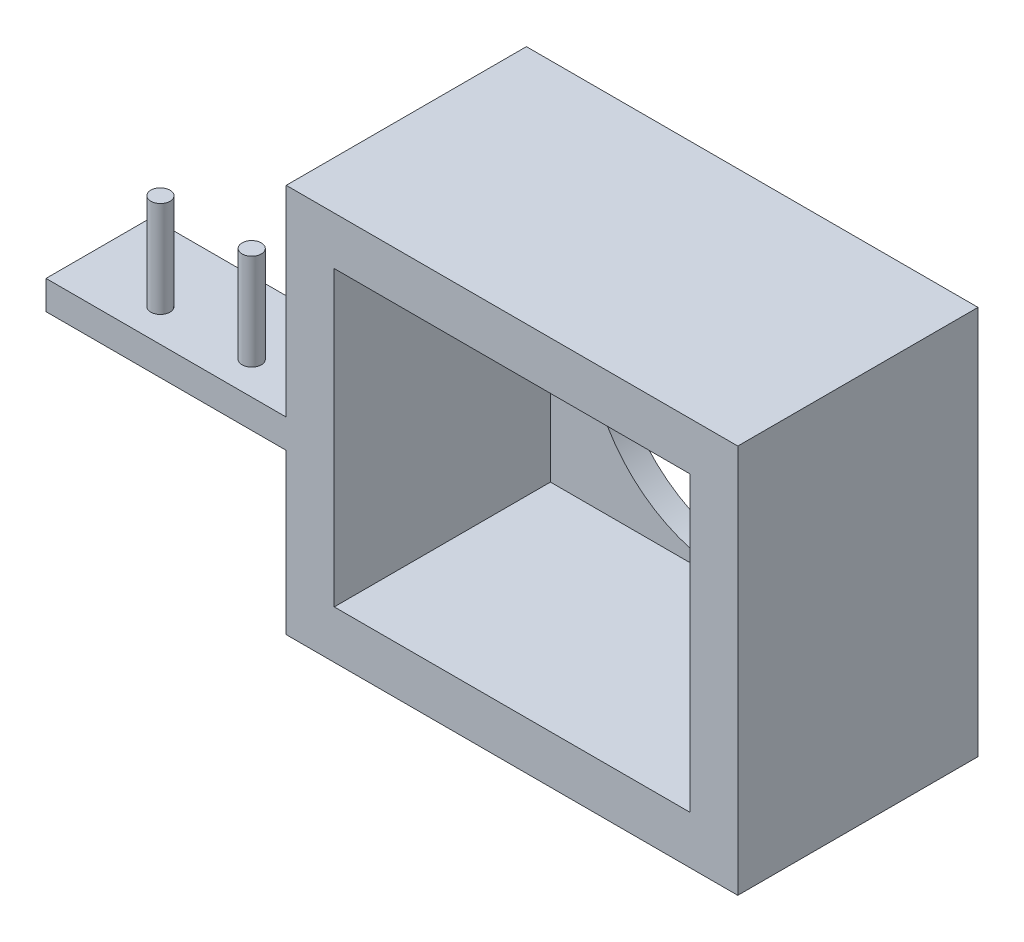
ISO-10303-21;
HEADER;
FILE_DESCRIPTION(('STEP AP214'),'2;1');
FILE_NAME('part.step','',(''),(''),'','','');
FILE_SCHEMA(('AUTOMOTIVE_DESIGN { 1 0 10303 214 1 1 1 1 }'));
ENDSEC;
DATA;
#1=APPLICATION_CONTEXT('core data for automotive mechanical design processes');
#2=APPLICATION_PROTOCOL_DEFINITION('international standard','automotive_design',2000,#1);
#3=PRODUCT_CONTEXT('',#1,'mechanical');
#4=PRODUCT('Part','Part','',(#3));
#5=PRODUCT_RELATED_PRODUCT_CATEGORY('part','',(#4));
#6=PRODUCT_DEFINITION_FORMATION('','',#4);
#7=PRODUCT_DEFINITION_CONTEXT('part definition',#1,'design');
#8=PRODUCT_DEFINITION('design','',#6,#7);
#9=PRODUCT_DEFINITION_SHAPE('','',#8);
#10=(LENGTH_UNIT() NAMED_UNIT(*) SI_UNIT(.MILLI.,.METRE.));
#11=(NAMED_UNIT(*) PLANE_ANGLE_UNIT() SI_UNIT($,.RADIAN.));
#12=(NAMED_UNIT(*) SI_UNIT($,.STERADIAN.) SOLID_ANGLE_UNIT());
#13=UNCERTAINTY_MEASURE_WITH_UNIT(LENGTH_MEASURE(1.E-05),#10,'distance_accuracy_value','');
#14=(GEOMETRIC_REPRESENTATION_CONTEXT(3) GLOBAL_UNCERTAINTY_ASSIGNED_CONTEXT((#13)) GLOBAL_UNIT_ASSIGNED_CONTEXT((#10,
#11,#12)) REPRESENTATION_CONTEXT('',''));
#15=CARTESIAN_POINT('',(0.,0.,0.));
#16=DIRECTION('',(0.,0.,1.));
#17=DIRECTION('',(1.,0.,0.));
#18=AXIS2_PLACEMENT_3D('',#15,#16,#17);
#19=CARTESIAN_POINT('',(1.25692750992854,54.4363006596743,0.));
#20=DIRECTION('',(0.,1.,0.));
#21=DIRECTION('',(0.,0.,1.));
#22=AXIS2_PLACEMENT_3D('',#19,#20,#21);
#23=PLANE('',#22);
#24=DIRECTION('',(-1.,0.,0.));
#25=VECTOR('',#24,1.);
#26=CARTESIAN_POINT('',(1.25692750992854,54.4363006596743,25.));
#27=LINE('',#26,#25);
#28=CARTESIAN_POINT('',(1.25692750992854,54.4363006596743,25.));
#29=VERTEX_POINT('',#28);
#30=CARTESIAN_POINT('',(-45.7430724900715,54.4363006596743,25.));
#31=VERTEX_POINT('',#30);
#32=EDGE_CURVE('E200',#29,#31,#27,.T.);
#33=ORIENTED_EDGE('',*,*,#32,.F.);
#34=DIRECTION('',(0.,0.,1.));
#35=VECTOR('',#34,1.);
#36=CARTESIAN_POINT('',(1.25692750992854,54.4363006596743,0.));
#37=LINE('',#36,#35);
#38=CARTESIAN_POINT('',(1.25692750992854,54.4363006596743,0.));
#39=VERTEX_POINT('',#38);
#40=EDGE_CURVE('E11',#39,#29,#37,.T.);
#41=ORIENTED_EDGE('',*,*,#40,.F.);
#42=DIRECTION('',(-1.,0.,0.));
#43=VECTOR('',#42,1.);
#44=CARTESIAN_POINT('',(1.25692750992854,54.4363006596743,0.));
#45=LINE('',#44,#43);
#46=CARTESIAN_POINT('',(-45.7430724900715,54.4363006596743,0.));
#47=VERTEX_POINT('',#46);
#48=EDGE_CURVE('E201',#39,#47,#45,.T.);
#49=ORIENTED_EDGE('',*,*,#48,.T.);
#50=DIRECTION('',(0.,0.,1.));
#51=VECTOR('',#50,1.);
#52=CARTESIAN_POINT('',(-45.7430724900715,54.4363006596743,0.));
#53=LINE('',#52,#51);
#54=EDGE_CURVE('E46',#47,#31,#53,.T.);
#55=ORIENTED_EDGE('',*,*,#54,.T.);
#56=EDGE_LOOP('',(#33,#41,#49,#55));
#57=FACE_BOUND('',#56,.T.);
#58=ADVANCED_FACE('F43',(#57),#23,.T.);
#59=CARTESIAN_POINT('',(1.25692750992854,13.9363006596743,0.));
#60=DIRECTION('',(1.,0.,0.));
#61=DIRECTION('',(0.,0.,-1.));
#62=AXIS2_PLACEMENT_3D('',#59,#60,#61);
#63=PLANE('',#62);
#64=DIRECTION('',(0.,1.,0.));
#65=VECTOR('',#64,1.);
#66=CARTESIAN_POINT('',(1.25692750992854,13.9363006596743,25.));
#67=LINE('',#66,#65);
#68=CARTESIAN_POINT('',(1.25692750992854,13.9363006596743,25.));
#69=VERTEX_POINT('',#68);
#70=EDGE_CURVE('E205',#69,#29,#67,.T.);
#71=ORIENTED_EDGE('',*,*,#70,.F.);
#72=DIRECTION('',(0.,0.,1.));
#73=VECTOR('',#72,1.);
#74=CARTESIAN_POINT('',(1.25692750992854,13.9363006596743,0.));
#75=LINE('',#74,#73);
#76=CARTESIAN_POINT('',(1.25692750992854,13.9363006596743,0.));
#77=VERTEX_POINT('',#76);
#78=EDGE_CURVE('E51',#77,#69,#75,.T.);
#79=ORIENTED_EDGE('',*,*,#78,.F.);
#80=DIRECTION('',(0.,1.,0.));
#81=VECTOR('',#80,1.);
#82=CARTESIAN_POINT('',(1.25692750992854,13.9363006596743,0.));
#83=LINE('',#82,#81);
#84=EDGE_CURVE('E211',#77,#39,#83,.T.);
#85=ORIENTED_EDGE('',*,*,#84,.T.);
#86=ORIENTED_EDGE('',*,*,#40,.T.);
#87=EDGE_LOOP('',(#71,#79,#85,#86));
#88=FACE_BOUND('',#87,.T.);
#89=ADVANCED_FACE('F239',(#88),#63,.T.);
#90=CARTESIAN_POINT('',(-45.7430724900715,13.9363006596743,0.));
#91=DIRECTION('',(0.,-1.,0.));
#92=DIRECTION('',(0.,0.,-1.));
#93=AXIS2_PLACEMENT_3D('',#90,#91,#92);
#94=PLANE('',#93);
#95=DIRECTION('',(1.,0.,0.));
#96=VECTOR('',#95,1.);
#97=CARTESIAN_POINT('',(-45.7430724900715,13.9363006596743,25.));
#98=LINE('',#97,#96);
#99=CARTESIAN_POINT('',(-45.7430724900715,13.9363006596743,25.));
#100=VERTEX_POINT('',#99);
#101=EDGE_CURVE('E220',#100,#69,#98,.T.);
#102=ORIENTED_EDGE('',*,*,#101,.F.);
#103=DIRECTION('',(0.,0.,1.));
#104=VECTOR('',#103,1.);
#105=CARTESIAN_POINT('',(-45.7430724900715,13.9363006596743,0.));
#106=LINE('',#105,#104);
#107=CARTESIAN_POINT('',(-45.7430724900715,13.9363006596743,0.));
#108=VERTEX_POINT('',#107);
#109=EDGE_CURVE('E225',#108,#100,#106,.T.);
#110=ORIENTED_EDGE('',*,*,#109,.F.);
#111=DIRECTION('',(1.,0.,0.));
#112=VECTOR('',#111,1.);
#113=CARTESIAN_POINT('',(-45.7430724900715,13.9363006596743,0.));
#114=LINE('',#113,#112);
#115=EDGE_CURVE('E208',#108,#77,#114,.T.);
#116=ORIENTED_EDGE('',*,*,#115,.T.);
#117=ORIENTED_EDGE('',*,*,#78,.T.);
#118=EDGE_LOOP('',(#102,#110,#116,#117));
#119=FACE_BOUND('',#118,.T.);
#120=ADVANCED_FACE('F245',(#119),#94,.T.);
#121=CARTESIAN_POINT('',(-45.7430724900715,54.4363006596743,0.));
#122=DIRECTION('',(-1.,0.,0.));
#123=DIRECTION('',(0.,0.,1.));
#124=AXIS2_PLACEMENT_3D('',#121,#122,#123);
#125=PLANE('',#124);
#126=DIRECTION('',(0.,0.,1.));
#127=VECTOR('',#126,1.);
#128=CARTESIAN_POINT('',(-45.7430724900715,30.5463006596743,25.));
#129=LINE('',#128,#127);
#130=CARTESIAN_POINT('',(-45.7430724900715,30.5463006596743,14.066148471072));
#131=VERTEX_POINT('',#130);
#132=CARTESIAN_POINT('',(-45.7430724900715,30.5463006596743,25.));
#133=VERTEX_POINT('',#132);
#134=EDGE_CURVE('E67',#131,#133,#129,.T.);
#135=ORIENTED_EDGE('',*,*,#134,.F.);
#136=DIRECTION('',(0.,-1.,0.));
#137=VECTOR('',#136,1.);
#138=CARTESIAN_POINT('',(-45.7430724900715,30.5463006596743,14.066148471072));
#139=LINE('',#138,#137);
#140=CARTESIAN_POINT('',(-45.7430724900715,33.5463006596743,14.066148471072));
#141=VERTEX_POINT('',#140);
#142=EDGE_CURVE('E186',#141,#131,#139,.T.);
#143=ORIENTED_EDGE('',*,*,#142,.F.);
#144=DIRECTION('',(0.,0.,-1.));
#145=VECTOR('',#144,1.);
#146=CARTESIAN_POINT('',(-45.7430724900715,33.5463006596743,14.066148471072));
#147=LINE('',#146,#145);
#148=CARTESIAN_POINT('',(-45.7430724900715,33.5463006596743,25.));
#149=VERTEX_POINT('',#148);
#150=EDGE_CURVE('E170',#149,#141,#147,.T.);
#151=ORIENTED_EDGE('',*,*,#150,.F.);
#152=DIRECTION('',(0.,-1.,0.));
#153=VECTOR('',#152,1.);
#154=CARTESIAN_POINT('',(-45.7430724900715,54.4363006596743,25.));
#155=LINE('',#154,#153);
#156=EDGE_CURVE('E217',#31,#149,#155,.T.);
#157=ORIENTED_EDGE('',*,*,#156,.F.);
#158=ORIENTED_EDGE('',*,*,#54,.F.);
#159=DIRECTION('',(0.,-1.,0.));
#160=VECTOR('',#159,1.);
#161=CARTESIAN_POINT('',(-45.7430724900715,54.4363006596743,0.));
#162=LINE('',#161,#160);
#163=EDGE_CURVE('E204',#47,#108,#162,.T.);
#164=ORIENTED_EDGE('',*,*,#163,.T.);
#165=ORIENTED_EDGE('',*,*,#109,.T.);
#166=EDGE_CURVE('E216',#133,#100,#155,.T.);
#167=ORIENTED_EDGE('',*,*,#166,.F.);
#168=EDGE_LOOP('',(#135,#143,#151,#157,#158,#164,#165,#167));
#169=FACE_BOUND('',#168,.T.);
#170=ADVANCED_FACE('F233',(#169),#125,.T.);
#171=CARTESIAN_POINT('',(0.,0.,0.));
#172=DIRECTION('',(0.,0.,1.));
#173=DIRECTION('',(1.,0.,0.));
#174=AXIS2_PLACEMENT_3D('',#171,#172,#173);
#175=PLANE('',#174);
#176=CARTESIAN_POINT('',(-22.2430724900715,34.1863006596743,0.));
#177=DIRECTION('',(0.,0.,1.));
#178=DIRECTION('',(1.,0.,0.));
#179=AXIS2_PLACEMENT_3D('',#176,#177,#178);
#180=CIRCLE('',#179,14.5);
#181=CARTESIAN_POINT('',(-7.74307249007146,34.1863006596743,0.));
#182=VERTEX_POINT('',#181);
#183=EDGE_CURVE('E434',#182,#182,#180,.T.);
#184=ORIENTED_EDGE('',*,*,#183,.T.);
#185=EDGE_LOOP('',(#184));
#186=FACE_BOUND('',#185,.T.);
#187=ORIENTED_EDGE('',*,*,#48,.F.);
#188=ORIENTED_EDGE('',*,*,#84,.F.);
#189=ORIENTED_EDGE('',*,*,#115,.F.);
#190=ORIENTED_EDGE('',*,*,#163,.F.);
#191=EDGE_LOOP('',(#187,#188,#189,#190));
#192=FACE_BOUND('',#191,.T.);
#193=ADVANCED_FACE('F242',(#186,#192),#175,.F.);
#194=CARTESIAN_POINT('',(0.,0.,25.));
#195=DIRECTION('',(0.,0.,1.));
#196=DIRECTION('',(1.,0.,0.));
#197=AXIS2_PLACEMENT_3D('',#194,#195,#196);
#198=PLANE('',#197);
#199=DIRECTION('',(0.,1.,0.));
#200=VECTOR('',#199,1.);
#201=CARTESIAN_POINT('',(-3.74307249007146,18.9363006596743,25.));
#202=LINE('',#201,#200);
#203=CARTESIAN_POINT('',(-3.74307249007146,18.9363006596743,25.));
#204=VERTEX_POINT('',#203);
#205=CARTESIAN_POINT('',(-3.74307249007146,49.4363006596743,25.));
#206=VERTEX_POINT('',#205);
#207=EDGE_CURVE('E59',#204,#206,#202,.T.);
#208=ORIENTED_EDGE('',*,*,#207,.F.);
#209=DIRECTION('',(1.,0.,0.));
#210=VECTOR('',#209,1.);
#211=CARTESIAN_POINT('',(-40.7430724900714,18.9363006596743,25.));
#212=LINE('',#211,#210);
#213=CARTESIAN_POINT('',(-40.7430724900714,18.9363006596743,25.));
#214=VERTEX_POINT('',#213);
#215=EDGE_CURVE('E152',#214,#204,#212,.T.);
#216=ORIENTED_EDGE('',*,*,#215,.F.);
#217=DIRECTION('',(0.,-1.,0.));
#218=VECTOR('',#217,1.);
#219=CARTESIAN_POINT('',(-40.7430724900714,49.4363006596743,25.));
#220=LINE('',#219,#218);
#221=CARTESIAN_POINT('',(-40.7430724900714,49.4363006596743,25.));
#222=VERTEX_POINT('',#221);
#223=EDGE_CURVE('E155',#222,#214,#220,.T.);
#224=ORIENTED_EDGE('',*,*,#223,.F.);
#225=DIRECTION('',(-1.,0.,0.));
#226=VECTOR('',#225,1.);
#227=CARTESIAN_POINT('',(-3.74307249007146,49.4363006596743,25.));
#228=LINE('',#227,#226);
#229=EDGE_CURVE('E164',#206,#222,#228,.T.);
#230=ORIENTED_EDGE('',*,*,#229,.F.);
#231=EDGE_LOOP('',(#208,#216,#224,#230));
#232=FACE_BOUND('',#231,.T.);
#233=ORIENTED_EDGE('',*,*,#32,.T.);
#234=ORIENTED_EDGE('',*,*,#156,.T.);
#235=DIRECTION('',(1.,0.,0.));
#236=VECTOR('',#235,1.);
#237=CARTESIAN_POINT('',(-70.7430724900715,33.5463006596743,25.));
#238=LINE('',#237,#236);
#239=CARTESIAN_POINT('',(-70.7430724900715,33.5463006596743,25.));
#240=VERTEX_POINT('',#239);
#241=EDGE_CURVE('E197',#240,#149,#238,.T.);
#242=ORIENTED_EDGE('',*,*,#241,.F.);
#243=DIRECTION('',(0.,1.,0.));
#244=VECTOR('',#243,1.);
#245=CARTESIAN_POINT('',(-70.7430724900715,33.5463006596743,25.));
#246=LINE('',#245,#244);
#247=CARTESIAN_POINT('',(-70.7430724900715,30.5463006596743,25.));
#248=VERTEX_POINT('',#247);
#249=EDGE_CURVE('E174',#248,#240,#246,.T.);
#250=ORIENTED_EDGE('',*,*,#249,.F.);
#251=DIRECTION('',(1.,0.,0.));
#252=VECTOR('',#251,1.);
#253=CARTESIAN_POINT('',(-70.7430724900715,30.5463006596743,25.));
#254=LINE('',#253,#252);
#255=EDGE_CURVE('E183',#248,#133,#254,.T.);
#256=ORIENTED_EDGE('',*,*,#255,.T.);
#257=ORIENTED_EDGE('',*,*,#166,.T.);
#258=ORIENTED_EDGE('',*,*,#101,.T.);
#259=ORIENTED_EDGE('',*,*,#70,.T.);
#260=EDGE_LOOP('',(#233,#234,#242,#250,#256,#257,#258,#259));
#261=FACE_BOUND('',#260,.T.);
#262=ADVANCED_FACE('F236',(#232,#261),#198,.T.);
#263=CARTESIAN_POINT('',(-70.7430724900715,33.5463006596743,14.066148471072));
#264=DIRECTION('',(0.,-1.,0.));
#265=DIRECTION('',(0.,0.,-1.));
#266=AXIS2_PLACEMENT_3D('',#263,#264,#265);
#267=PLANE('',#266);
#268=CARTESIAN_POINT('',(-62.2430724900715,33.5463006596743,21.5904470533132));
#269=DIRECTION('',(0.,-1.,0.));
#270=DIRECTION('',(0.,0.,-1.));
#271=AXIS2_PLACEMENT_3D('',#268,#269,#270);
#272=CIRCLE('',#271,1.);
#273=CARTESIAN_POINT('',(-62.2430724900715,33.5463006596743,20.5904470533132));
#274=VERTEX_POINT('',#273);
#275=EDGE_CURVE('E439',#274,#274,#272,.T.);
#276=ORIENTED_EDGE('',*,*,#275,.T.);
#277=EDGE_LOOP('',(#276));
#278=FACE_BOUND('',#277,.T.);
#279=CARTESIAN_POINT('',(-52.7430724900715,33.5463006596743,21.5904470533132));
#280=DIRECTION('',(0.,-1.,0.));
#281=DIRECTION('',(0.,0.,-1.));
#282=AXIS2_PLACEMENT_3D('',#279,#280,#281);
#283=CIRCLE('',#282,1.);
#284=CARTESIAN_POINT('',(-52.7430724900715,33.5463006596743,20.5904470533132));
#285=VERTEX_POINT('',#284);
#286=EDGE_CURVE('E446',#285,#285,#283,.T.);
#287=ORIENTED_EDGE('',*,*,#286,.T.);
#288=EDGE_LOOP('',(#287));
#289=FACE_BOUND('',#288,.T.);
#290=ORIENTED_EDGE('',*,*,#150,.T.);
#291=DIRECTION('',(1.,0.,0.));
#292=VECTOR('',#291,1.);
#293=CARTESIAN_POINT('',(-70.7430724900715,33.5463006596743,14.066148471072));
#294=LINE('',#293,#292);
#295=CARTESIAN_POINT('',(-70.7430724900715,33.5463006596743,14.066148471072));
#296=VERTEX_POINT('',#295);
#297=EDGE_CURVE('E194',#296,#141,#294,.T.);
#298=ORIENTED_EDGE('',*,*,#297,.F.);
#299=DIRECTION('',(0.,0.,-1.));
#300=VECTOR('',#299,1.);
#301=CARTESIAN_POINT('',(-70.7430724900715,33.5463006596743,14.066148471072));
#302=LINE('',#301,#300);
#303=EDGE_CURVE('E177',#240,#296,#302,.T.);
#304=ORIENTED_EDGE('',*,*,#303,.F.);
#305=ORIENTED_EDGE('',*,*,#241,.T.);
#306=EDGE_LOOP('',(#290,#298,#304,#305));
#307=FACE_BOUND('',#306,.T.);
#308=ADVANCED_FACE('F293',(#278,#289,#307),#267,.F.);
#309=CARTESIAN_POINT('',(-70.7430724900715,30.5463006596743,14.066148471072));
#310=DIRECTION('',(0.,0.,1.));
#311=DIRECTION('',(1.,0.,0.));
#312=AXIS2_PLACEMENT_3D('',#309,#310,#311);
#313=PLANE('',#312);
#314=ORIENTED_EDGE('',*,*,#142,.T.);
#315=DIRECTION('',(1.,0.,0.));
#316=VECTOR('',#315,1.);
#317=CARTESIAN_POINT('',(-70.7430724900715,30.5463006596743,14.066148471072));
#318=LINE('',#317,#316);
#319=CARTESIAN_POINT('',(-70.7430724900715,30.5463006596743,14.066148471072));
#320=VERTEX_POINT('',#319);
#321=EDGE_CURVE('E191',#320,#131,#318,.T.);
#322=ORIENTED_EDGE('',*,*,#321,.F.);
#323=DIRECTION('',(0.,-1.,0.));
#324=VECTOR('',#323,1.);
#325=CARTESIAN_POINT('',(-70.7430724900715,30.5463006596743,14.066148471072));
#326=LINE('',#325,#324);
#327=EDGE_CURVE('E179',#296,#320,#326,.T.);
#328=ORIENTED_EDGE('',*,*,#327,.F.);
#329=ORIENTED_EDGE('',*,*,#297,.T.);
#330=EDGE_LOOP('',(#314,#322,#328,#329));
#331=FACE_BOUND('',#330,.T.);
#332=ADVANCED_FACE('F308',(#331),#313,.F.);
#333=CARTESIAN_POINT('',(-70.7430724900715,30.5463006596743,25.));
#334=DIRECTION('',(0.,1.,0.));
#335=DIRECTION('',(0.,0.,1.));
#336=AXIS2_PLACEMENT_3D('',#333,#334,#335);
#337=PLANE('',#336);
#338=ORIENTED_EDGE('',*,*,#134,.T.);
#339=ORIENTED_EDGE('',*,*,#255,.F.);
#340=DIRECTION('',(0.,0.,1.));
#341=VECTOR('',#340,1.);
#342=CARTESIAN_POINT('',(-70.7430724900715,30.5463006596743,25.));
#343=LINE('',#342,#341);
#344=EDGE_CURVE('E181',#320,#248,#343,.T.);
#345=ORIENTED_EDGE('',*,*,#344,.F.);
#346=ORIENTED_EDGE('',*,*,#321,.T.);
#347=EDGE_LOOP('',(#338,#339,#345,#346));
#348=FACE_BOUND('',#347,.T.);
#349=ADVANCED_FACE('F319',(#348),#337,.F.);
#350=CARTESIAN_POINT('',(-70.7430724900715,0.,0.));
#351=DIRECTION('',(1.,0.,0.));
#352=DIRECTION('',(0.,0.,-1.));
#353=AXIS2_PLACEMENT_3D('',#350,#351,#352);
#354=PLANE('',#353);
#355=ORIENTED_EDGE('',*,*,#249,.T.);
#356=ORIENTED_EDGE('',*,*,#303,.T.);
#357=ORIENTED_EDGE('',*,*,#327,.T.);
#358=ORIENTED_EDGE('',*,*,#344,.T.);
#359=EDGE_LOOP('',(#355,#356,#357,#358));
#360=FACE_BOUND('',#359,.T.);
#361=ADVANCED_FACE('F329',(#360),#354,.F.);
#362=CARTESIAN_POINT('',(-3.74307249007146,18.9363006596743,2.5));
#363=DIRECTION('',(1.,0.,0.));
#364=DIRECTION('',(0.,1.,0.));
#365=AXIS2_PLACEMENT_3D('',#362,#363,#364);
#366=PLANE('',#365);
#367=ORIENTED_EDGE('',*,*,#207,.T.);
#368=DIRECTION('',(0.,0.,1.));
#369=VECTOR('',#368,1.);
#370=CARTESIAN_POINT('',(-3.74307249007146,49.4363006596743,2.5));
#371=LINE('',#370,#369);
#372=CARTESIAN_POINT('',(-3.74307249007146,49.4363006596743,2.5));
#373=VERTEX_POINT('',#372);
#374=EDGE_CURVE('E130',#373,#206,#371,.T.);
#375=ORIENTED_EDGE('',*,*,#374,.F.);
#376=DIRECTION('',(0.,1.,0.));
#377=VECTOR('',#376,1.);
#378=CARTESIAN_POINT('',(-3.74307249007146,18.9363006596743,2.5));
#379=LINE('',#378,#377);
#380=CARTESIAN_POINT('',(-3.74307249007146,18.9363006596743,2.5));
#381=VERTEX_POINT('',#380);
#382=EDGE_CURVE('E134',#381,#373,#379,.T.);
#383=ORIENTED_EDGE('',*,*,#382,.F.);
#384=DIRECTION('',(0.,0.,1.));
#385=VECTOR('',#384,1.);
#386=CARTESIAN_POINT('',(-3.74307249007146,18.9363006596743,2.5));
#387=LINE('',#386,#385);
#388=EDGE_CURVE('E168',#381,#204,#387,.T.);
#389=ORIENTED_EDGE('',*,*,#388,.T.);
#390=EDGE_LOOP('',(#367,#375,#383,#389));
#391=FACE_BOUND('',#390,.T.);
#392=ADVANCED_FACE('F132',(#391),#366,.F.);
#393=CARTESIAN_POINT('',(-40.7430724900714,18.9363006596743,2.5));
#394=DIRECTION('',(0.,-1.,0.));
#395=DIRECTION('',(0.,0.,-1.));
#396=AXIS2_PLACEMENT_3D('',#393,#394,#395);
#397=PLANE('',#396);
#398=ORIENTED_EDGE('',*,*,#215,.T.);
#399=ORIENTED_EDGE('',*,*,#388,.F.);
#400=DIRECTION('',(1.,0.,0.));
#401=VECTOR('',#400,1.);
#402=CARTESIAN_POINT('',(-40.7430724900714,18.9363006596743,2.5));
#403=LINE('',#402,#401);
#404=CARTESIAN_POINT('',(-40.7430724900714,18.9363006596743,2.5));
#405=VERTEX_POINT('',#404);
#406=EDGE_CURVE('E140',#405,#381,#403,.T.);
#407=ORIENTED_EDGE('',*,*,#406,.F.);
#408=DIRECTION('',(0.,0.,1.));
#409=VECTOR('',#408,1.);
#410=CARTESIAN_POINT('',(-40.7430724900714,18.9363006596743,2.5));
#411=LINE('',#410,#409);
#412=EDGE_CURVE('E171',#405,#214,#411,.T.);
#413=ORIENTED_EDGE('',*,*,#412,.T.);
#414=EDGE_LOOP('',(#398,#399,#407,#413));
#415=FACE_BOUND('',#414,.T.);
#416=ADVANCED_FACE('F346',(#415),#397,.F.);
#417=CARTESIAN_POINT('',(-40.7430724900714,49.4363006596743,2.5));
#418=DIRECTION('',(-1.,0.,0.));
#419=DIRECTION('',(0.,0.,1.));
#420=AXIS2_PLACEMENT_3D('',#417,#418,#419);
#421=PLANE('',#420);
#422=ORIENTED_EDGE('',*,*,#223,.T.);
#423=ORIENTED_EDGE('',*,*,#412,.F.);
#424=DIRECTION('',(0.,-1.,0.));
#425=VECTOR('',#424,1.);
#426=CARTESIAN_POINT('',(-40.7430724900714,49.4363006596743,2.5));
#427=LINE('',#426,#425);
#428=CARTESIAN_POINT('',(-40.7430724900714,49.4363006596743,2.5));
#429=VERTEX_POINT('',#428);
#430=EDGE_CURVE('E148',#429,#405,#427,.T.);
#431=ORIENTED_EDGE('',*,*,#430,.F.);
#432=DIRECTION('',(0.,0.,1.));
#433=VECTOR('',#432,1.);
#434=CARTESIAN_POINT('',(-40.7430724900714,49.4363006596743,2.5));
#435=LINE('',#434,#433);
#436=EDGE_CURVE('E139',#429,#222,#435,.T.);
#437=ORIENTED_EDGE('',*,*,#436,.T.);
#438=EDGE_LOOP('',(#422,#423,#431,#437));
#439=FACE_BOUND('',#438,.T.);
#440=ADVANCED_FACE('F355',(#439),#421,.F.);
#441=CARTESIAN_POINT('',(-3.74307249007146,49.4363006596743,2.5));
#442=DIRECTION('',(0.,1.,0.));
#443=DIRECTION('',(0.,0.,1.));
#444=AXIS2_PLACEMENT_3D('',#441,#442,#443);
#445=PLANE('',#444);
#446=ORIENTED_EDGE('',*,*,#229,.T.);
#447=ORIENTED_EDGE('',*,*,#436,.F.);
#448=DIRECTION('',(-1.,0.,0.));
#449=VECTOR('',#448,1.);
#450=CARTESIAN_POINT('',(-3.74307249007146,49.4363006596743,2.5));
#451=LINE('',#450,#449);
#452=EDGE_CURVE('E143',#373,#429,#451,.T.);
#453=ORIENTED_EDGE('',*,*,#452,.F.);
#454=ORIENTED_EDGE('',*,*,#374,.T.);
#455=EDGE_LOOP('',(#446,#447,#453,#454));
#456=FACE_BOUND('',#455,.T.);
#457=ADVANCED_FACE('F144',(#456),#445,.F.);
#458=CARTESIAN_POINT('',(0.,0.,2.5));
#459=DIRECTION('',(0.,0.,1.));
#460=DIRECTION('',(1.,0.,0.));
#461=AXIS2_PLACEMENT_3D('',#458,#459,#460);
#462=PLANE('',#461);
#463=CARTESIAN_POINT('',(-22.2430724900715,34.1863006596743,2.5));
#464=DIRECTION('',(0.,0.,1.));
#465=DIRECTION('',(1.,0.,0.));
#466=AXIS2_PLACEMENT_3D('',#463,#464,#465);
#467=CIRCLE('',#466,14.5);
#468=CARTESIAN_POINT('',(-7.74307249007146,34.1863006596743,2.5));
#469=VERTEX_POINT('',#468);
#470=EDGE_CURVE('E437',#469,#469,#467,.T.);
#471=ORIENTED_EDGE('',*,*,#470,.F.);
#472=EDGE_LOOP('',(#471));
#473=FACE_BOUND('',#472,.T.);
#474=ORIENTED_EDGE('',*,*,#382,.T.);
#475=ORIENTED_EDGE('',*,*,#452,.T.);
#476=ORIENTED_EDGE('',*,*,#430,.T.);
#477=ORIENTED_EDGE('',*,*,#406,.T.);
#478=EDGE_LOOP('',(#474,#475,#476,#477));
#479=FACE_BOUND('',#478,.T.);
#480=ADVANCED_FACE('F150',(#473,#479),#462,.T.);
#481=CARTESIAN_POINT('',(-52.7430724900715,43.5463006596743,21.5904470533132));
#482=DIRECTION('',(0.,-1.,0.));
#483=DIRECTION('',(0.,0.,-1.));
#484=AXIS2_PLACEMENT_3D('',#481,#482,#483);
#485=CYLINDRICAL_SURFACE('',#484,1.);
#486=CARTESIAN_POINT('',(-52.7430724900715,43.5463006596743,21.5904470533132));
#487=DIRECTION('',(0.,-1.,0.));
#488=DIRECTION('',(0.,0.,-1.));
#489=AXIS2_PLACEMENT_3D('',#486,#487,#488);
#490=CIRCLE('',#489,1.);
#491=CARTESIAN_POINT('',(-52.7430724900715,43.5463006596743,20.5904470533132));
#492=VERTEX_POINT('',#491);
#493=EDGE_CURVE('E158',#492,#492,#490,.T.);
#494=ORIENTED_EDGE('',*,*,#493,.T.);
#495=EDGE_LOOP('',(#494));
#496=FACE_BOUND('',#495,.T.);
#497=ORIENTED_EDGE('',*,*,#286,.F.);
#498=EDGE_LOOP('',(#497));
#499=FACE_BOUND('',#498,.T.);
#500=ADVANCED_FACE('F382',(#496,#499),#485,.T.);
#501=CARTESIAN_POINT('',(-51.7430724900715,43.5463006596743,21.5904470533132));
#502=DIRECTION('',(0.,1.,0.));
#503=DIRECTION('',(0.,0.,1.));
#504=AXIS2_PLACEMENT_3D('',#501,#502,#503);
#505=PLANE('',#504);
#506=ORIENTED_EDGE('',*,*,#493,.F.);
#507=EDGE_LOOP('',(#506));
#508=FACE_BOUND('',#507,.T.);
#509=ADVANCED_FACE('F392',(#508),#505,.T.);
#510=CARTESIAN_POINT('',(-62.2430724900715,43.5463006596743,21.5904470533132));
#511=DIRECTION('',(0.,-1.,0.));
#512=DIRECTION('',(0.,0.,-1.));
#513=AXIS2_PLACEMENT_3D('',#510,#511,#512);
#514=CYLINDRICAL_SURFACE('',#513,1.);
#515=CARTESIAN_POINT('',(-62.2430724900715,43.5463006596743,21.5904470533132));
#516=DIRECTION('',(0.,-1.,0.));
#517=DIRECTION('',(0.,0.,-1.));
#518=AXIS2_PLACEMENT_3D('',#515,#516,#517);
#519=CIRCLE('',#518,1.);
#520=CARTESIAN_POINT('',(-62.2430724900715,43.5463006596743,20.5904470533132));
#521=VERTEX_POINT('',#520);
#522=EDGE_CURVE('E444',#521,#521,#519,.T.);
#523=ORIENTED_EDGE('',*,*,#522,.T.);
#524=EDGE_LOOP('',(#523));
#525=FACE_BOUND('',#524,.T.);
#526=ORIENTED_EDGE('',*,*,#275,.F.);
#527=EDGE_LOOP('',(#526));
#528=FACE_BOUND('',#527,.T.);
#529=ADVANCED_FACE('F401',(#525,#528),#514,.T.);
#530=CARTESIAN_POINT('',(-61.2430724900715,43.5463006596743,21.5904470533132));
#531=DIRECTION('',(0.,1.,0.));
#532=DIRECTION('',(0.,0.,1.));
#533=AXIS2_PLACEMENT_3D('',#530,#531,#532);
#534=PLANE('',#533);
#535=ORIENTED_EDGE('',*,*,#522,.F.);
#536=EDGE_LOOP('',(#535));
#537=FACE_BOUND('',#536,.T.);
#538=ADVANCED_FACE('F410',(#537),#534,.T.);
#539=CARTESIAN_POINT('',(-22.2430724900715,34.1863006596743,2.5));
#540=DIRECTION('',(0.,0.,1.));
#541=DIRECTION('',(1.,0.,0.));
#542=AXIS2_PLACEMENT_3D('',#539,#540,#541);
#543=CYLINDRICAL_SURFACE('',#542,14.5);
#544=ORIENTED_EDGE('',*,*,#183,.F.);
#545=EDGE_LOOP('',(#544));
#546=FACE_BOUND('',#545,.T.);
#547=ORIENTED_EDGE('',*,*,#470,.T.);
#548=EDGE_LOOP('',(#547));
#549=FACE_BOUND('',#548,.T.);
#550=ADVANCED_FACE('F419',(#546,#549),#543,.F.);
#551=CLOSED_SHELL('',(#58,#89,#120,#170,#193,#262,#308,#332,#349,#361,#392,#416,#440,#457,#480,
#500,#509,#529,#538,#550));
#552=MANIFOLD_SOLID_BREP('B2',#551);
#553=ADVANCED_BREP_SHAPE_REPRESENTATION('',(#18,#552),#14);
#554=SHAPE_DEFINITION_REPRESENTATION(#9,#553);
ENDSEC;
END-ISO-10303-21;
